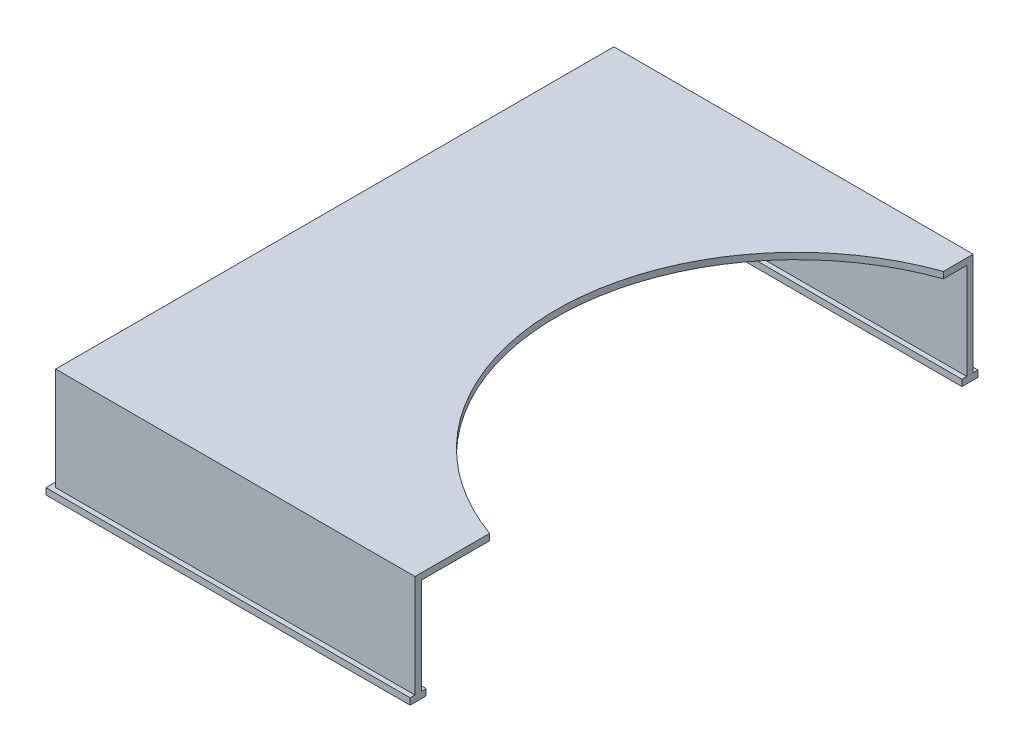
ISO-10303-21;
HEADER;
FILE_DESCRIPTION(('STEP AP214'),'2;1');
FILE_NAME('part.step','',(''),(''),'','','');
FILE_SCHEMA(('AUTOMOTIVE_DESIGN { 1 0 10303 214 1 1 1 1 }'));
ENDSEC;
DATA;
#1=APPLICATION_CONTEXT('core data for automotive mechanical design processes');
#2=APPLICATION_PROTOCOL_DEFINITION('international standard','automotive_design',2000,#1);
#3=PRODUCT_CONTEXT('',#1,'mechanical');
#4=PRODUCT('Part','Part','',(#3));
#5=PRODUCT_RELATED_PRODUCT_CATEGORY('part','',(#4));
#6=PRODUCT_DEFINITION_FORMATION('','',#4);
#7=PRODUCT_DEFINITION_CONTEXT('part definition',#1,'design');
#8=PRODUCT_DEFINITION('design','',#6,#7);
#9=PRODUCT_DEFINITION_SHAPE('','',#8);
#10=(LENGTH_UNIT() NAMED_UNIT(*) SI_UNIT(.MILLI.,.METRE.));
#11=(NAMED_UNIT(*) PLANE_ANGLE_UNIT() SI_UNIT($,.RADIAN.));
#12=(NAMED_UNIT(*) SI_UNIT($,.STERADIAN.) SOLID_ANGLE_UNIT());
#13=UNCERTAINTY_MEASURE_WITH_UNIT(LENGTH_MEASURE(1.E-05),#10,'distance_accuracy_value','');
#14=(GEOMETRIC_REPRESENTATION_CONTEXT(3) GLOBAL_UNCERTAINTY_ASSIGNED_CONTEXT((#13)) GLOBAL_UNIT_ASSIGNED_CONTEXT((#10,
#11,#12)) REPRESENTATION_CONTEXT('',''));
#15=CARTESIAN_POINT('',(0.,0.,0.));
#16=DIRECTION('',(0.,0.,1.));
#17=DIRECTION('',(1.,0.,0.));
#18=AXIS2_PLACEMENT_3D('',#15,#16,#17);
#19=CARTESIAN_POINT('',(0.,32.,0.));
#20=DIRECTION('',(1.,0.,0.));
#21=DIRECTION('',(0.,0.,-1.));
#22=AXIS2_PLACEMENT_3D('',#19,#20,#21);
#23=PLANE('',#22);
#24=DIRECTION('',(0.,-1.,0.));
#25=VECTOR('',#24,1.);
#26=CARTESIAN_POINT('',(0.,32.,0.));
#27=LINE('',#26,#25);
#28=CARTESIAN_POINT('',(0.,30.,0.));
#29=VERTEX_POINT('',#28);
#30=CARTESIAN_POINT('',(0.,0.,0.));
#31=VERTEX_POINT('',#30);
#32=EDGE_CURVE('E216',#29,#31,#27,.T.);
#33=ORIENTED_EDGE('',*,*,#32,.F.);
#34=DIRECTION('',(0.,0.,1.));
#35=VECTOR('',#34,1.);
#36=CARTESIAN_POINT('',(0.,30.,0.));
#37=LINE('',#36,#35);
#38=CARTESIAN_POINT('',(0.,30.,170.));
#39=VERTEX_POINT('',#38);
#40=EDGE_CURVE('E267',#29,#39,#37,.T.);
#41=ORIENTED_EDGE('',*,*,#40,.T.);
#42=DIRECTION('',(0.,-1.,0.));
#43=VECTOR('',#42,1.);
#44=CARTESIAN_POINT('',(0.,32.,170.));
#45=LINE('',#44,#43);
#46=CARTESIAN_POINT('',(0.,0.,170.));
#47=VERTEX_POINT('',#46);
#48=EDGE_CURVE('E219',#39,#47,#45,.T.);
#49=ORIENTED_EDGE('',*,*,#48,.T.);
#50=DIRECTION('',(0.,0.,1.));
#51=VECTOR('',#50,1.);
#52=CARTESIAN_POINT('',(0.,0.,0.));
#53=LINE('',#52,#51);
#54=EDGE_CURVE('E207',#31,#47,#53,.T.);
#55=ORIENTED_EDGE('',*,*,#54,.F.);
#56=EDGE_LOOP('',(#33,#41,#49,#55));
#57=FACE_BOUND('',#56,.T.);
#58=ADVANCED_FACE('F39',(#57),#23,.T.);
#59=CARTESIAN_POINT('',(0.,32.,170.));
#60=DIRECTION('',(0.,0.,-1.));
#61=DIRECTION('',(-1.,0.,0.));
#62=AXIS2_PLACEMENT_3D('',#59,#60,#61);
#63=PLANE('',#62);
#64=DIRECTION('',(0.,1.,0.));
#65=VECTOR('',#64,1.);
#66=CARTESIAN_POINT('',(110.,32.,170.));
#67=LINE('',#66,#65);
#68=CARTESIAN_POINT('',(110.,0.,170.));
#69=VERTEX_POINT('',#68);
#70=CARTESIAN_POINT('',(110.,30.,170.));
#71=VERTEX_POINT('',#70);
#72=EDGE_CURVE('E308',#69,#71,#67,.T.);
#73=ORIENTED_EDGE('',*,*,#72,.F.);
#74=DIRECTION('',(1.,0.,0.));
#75=VECTOR('',#74,1.);
#76=CARTESIAN_POINT('',(0.,0.,170.));
#77=LINE('',#76,#75);
#78=EDGE_CURVE('E211',#47,#69,#77,.T.);
#79=ORIENTED_EDGE('',*,*,#78,.F.);
#80=ORIENTED_EDGE('',*,*,#48,.F.);
#81=DIRECTION('',(1.,0.,0.));
#82=VECTOR('',#81,1.);
#83=CARTESIAN_POINT('',(-2.,30.,170.));
#84=LINE('',#83,#82);
#85=EDGE_CURVE('E259',#39,#71,#84,.T.);
#86=ORIENTED_EDGE('',*,*,#85,.T.);
#87=EDGE_LOOP('',(#73,#79,#80,#86));
#88=FACE_BOUND('',#87,.T.);
#89=ADVANCED_FACE('F344',(#88),#63,.T.);
#90=CARTESIAN_POINT('',(0.,32.,0.));
#91=DIRECTION('',(0.,0.,1.));
#92=DIRECTION('',(1.,0.,0.));
#93=AXIS2_PLACEMENT_3D('',#90,#91,#92);
#94=PLANE('',#93);
#95=DIRECTION('',(0.,-1.,0.));
#96=VECTOR('',#95,1.);
#97=CARTESIAN_POINT('',(110.,32.,0.));
#98=LINE('',#97,#96);
#99=CARTESIAN_POINT('',(110.,30.,0.));
#100=VERTEX_POINT('',#99);
#101=CARTESIAN_POINT('',(110.,0.,0.));
#102=VERTEX_POINT('',#101);
#103=EDGE_CURVE('E311',#100,#102,#98,.T.);
#104=ORIENTED_EDGE('',*,*,#103,.F.);
#105=DIRECTION('',(-1.,0.,0.));
#106=VECTOR('',#105,1.);
#107=CARTESIAN_POINT('',(0.,30.,0.));
#108=LINE('',#107,#106);
#109=EDGE_CURVE('E242',#100,#29,#108,.T.);
#110=ORIENTED_EDGE('',*,*,#109,.T.);
#111=ORIENTED_EDGE('',*,*,#32,.T.);
#112=DIRECTION('',(-1.,0.,0.));
#113=VECTOR('',#112,1.);
#114=CARTESIAN_POINT('',(0.,0.,0.));
#115=LINE('',#114,#113);
#116=EDGE_CURVE('E214',#102,#31,#115,.T.);
#117=ORIENTED_EDGE('',*,*,#116,.F.);
#118=EDGE_LOOP('',(#104,#110,#111,#117));
#119=FACE_BOUND('',#118,.T.);
#120=ADVANCED_FACE('F350',(#119),#94,.T.);
#121=CARTESIAN_POINT('',(0.,32.,0.));
#122=DIRECTION('',(0.,1.,0.));
#123=DIRECTION('',(0.,0.,1.));
#124=AXIS2_PLACEMENT_3D('',#121,#122,#123);
#125=PLANE('',#124);
#126=DIRECTION('',(0.,0.,1.));
#127=VECTOR('',#126,1.);
#128=CARTESIAN_POINT('',(110.,32.,-3.5));
#129=LINE('',#128,#127);
#130=CARTESIAN_POINT('',(110.,32.,-2.));
#131=VERTEX_POINT('',#130);
#132=CARTESIAN_POINT('',(110.,32.,7.28932188134522));
#133=VERTEX_POINT('',#132);
#134=EDGE_CURVE('E54',#131,#133,#129,.T.);
#135=ORIENTED_EDGE('',*,*,#134,.F.);
#136=DIRECTION('',(-1.,0.,0.));
#137=VECTOR('',#136,1.);
#138=CARTESIAN_POINT('',(-2.,32.,-2.));
#139=LINE('',#138,#137);
#140=CARTESIAN_POINT('',(-2.,32.,-2.));
#141=VERTEX_POINT('',#140);
#142=EDGE_CURVE('E228',#131,#141,#139,.T.);
#143=ORIENTED_EDGE('',*,*,#142,.T.);
#144=DIRECTION('',(0.,0.,1.));
#145=VECTOR('',#144,1.);
#146=CARTESIAN_POINT('',(-2.,32.,-2.));
#147=LINE('',#146,#145);
#148=CARTESIAN_POINT('',(-2.,32.,172.));
#149=VERTEX_POINT('',#148);
#150=EDGE_CURVE('E222',#141,#149,#147,.T.);
#151=ORIENTED_EDGE('',*,*,#150,.T.);
#152=DIRECTION('',(1.,0.,0.));
#153=VECTOR('',#152,1.);
#154=CARTESIAN_POINT('',(-2.,32.,172.));
#155=LINE('',#154,#153);
#156=CARTESIAN_POINT('',(110.,32.,172.));
#157=VERTEX_POINT('',#156);
#158=EDGE_CURVE('E224',#149,#157,#155,.T.);
#159=ORIENTED_EDGE('',*,*,#158,.T.);
#160=CARTESIAN_POINT('',(110.,32.,148.710678118655));
#161=VERTEX_POINT('',#160);
#162=EDGE_CURVE('E256',#161,#157,#129,.T.);
#163=ORIENTED_EDGE('',*,*,#162,.F.);
#164=CARTESIAN_POINT('',(135.,32.,78.));
#165=DIRECTION('',(0.,1.,0.));
#166=DIRECTION('',(0.,0.,1.));
#167=AXIS2_PLACEMENT_3D('',#164,#165,#166);
#168=CIRCLE('',#167,75.);
#169=EDGE_CURVE('E248',#133,#161,#168,.T.);
#170=ORIENTED_EDGE('',*,*,#169,.F.);
#171=EDGE_LOOP('',(#135,#143,#151,#159,#163,#170));
#172=FACE_BOUND('',#171,.T.);
#173=ADVANCED_FACE('F254',(#172),#125,.T.);
#174=CARTESIAN_POINT('',(-2.,32.,-2.));
#175=DIRECTION('',(1.,0.,0.));
#176=DIRECTION('',(0.,0.,-1.));
#177=AXIS2_PLACEMENT_3D('',#174,#175,#176);
#178=PLANE('',#177);
#179=DIRECTION('',(0.,-1.,0.));
#180=VECTOR('',#179,1.);
#181=CARTESIAN_POINT('',(-2.,32.,172.));
#182=LINE('',#181,#180);
#183=CARTESIAN_POINT('',(-2.,0.,172.));
#184=VERTEX_POINT('',#183);
#185=EDGE_CURVE('E239',#149,#184,#182,.T.);
#186=ORIENTED_EDGE('',*,*,#185,.F.);
#187=ORIENTED_EDGE('',*,*,#150,.F.);
#188=DIRECTION('',(0.,-1.,0.));
#189=VECTOR('',#188,1.);
#190=CARTESIAN_POINT('',(-2.,32.,-2.));
#191=LINE('',#190,#189);
#192=CARTESIAN_POINT('',(-2.,0.,-2.));
#193=VERTEX_POINT('',#192);
#194=EDGE_CURVE('E230',#141,#193,#191,.T.);
#195=ORIENTED_EDGE('',*,*,#194,.T.);
#196=DIRECTION('',(0.,0.,1.));
#197=VECTOR('',#196,1.);
#198=CARTESIAN_POINT('',(-2.,0.,-2.));
#199=LINE('',#198,#197);
#200=EDGE_CURVE('E221',#193,#184,#199,.T.);
#201=ORIENTED_EDGE('',*,*,#200,.T.);
#202=EDGE_LOOP('',(#186,#187,#195,#201));
#203=FACE_BOUND('',#202,.T.);
#204=ADVANCED_FACE('F41',(#203),#178,.F.);
#205=CARTESIAN_POINT('',(-2.,32.,172.));
#206=DIRECTION('',(0.,0.,-1.));
#207=DIRECTION('',(-1.,0.,0.));
#208=AXIS2_PLACEMENT_3D('',#205,#206,#207);
#209=PLANE('',#208);
#210=DIRECTION('',(1.,0.,0.));
#211=VECTOR('',#210,1.);
#212=CARTESIAN_POINT('',(-2.,0.,172.));
#213=LINE('',#212,#211);
#214=CARTESIAN_POINT('',(110.,0.,172.));
#215=VERTEX_POINT('',#214);
#216=EDGE_CURVE('E233',#184,#215,#213,.T.);
#217=ORIENTED_EDGE('',*,*,#216,.T.);
#218=DIRECTION('',(0.,1.,0.));
#219=VECTOR('',#218,1.);
#220=CARTESIAN_POINT('',(110.,32.,172.));
#221=LINE('',#220,#219);
#222=EDGE_CURVE('E318',#215,#157,#221,.T.);
#223=ORIENTED_EDGE('',*,*,#222,.T.);
#224=ORIENTED_EDGE('',*,*,#158,.F.);
#225=ORIENTED_EDGE('',*,*,#185,.T.);
#226=EDGE_LOOP('',(#217,#223,#224,#225));
#227=FACE_BOUND('',#226,.T.);
#228=ADVANCED_FACE('F336',(#227),#209,.F.);
#229=CARTESIAN_POINT('',(-2.,32.,-2.));
#230=DIRECTION('',(0.,0.,1.));
#231=DIRECTION('',(1.,0.,0.));
#232=AXIS2_PLACEMENT_3D('',#229,#230,#231);
#233=PLANE('',#232);
#234=ORIENTED_EDGE('',*,*,#142,.F.);
#235=DIRECTION('',(0.,-1.,0.));
#236=VECTOR('',#235,1.);
#237=CARTESIAN_POINT('',(110.,32.,-2.));
#238=LINE('',#237,#236);
#239=CARTESIAN_POINT('',(110.,0.,-2.));
#240=VERTEX_POINT('',#239);
#241=EDGE_CURVE('E257',#131,#240,#238,.T.);
#242=ORIENTED_EDGE('',*,*,#241,.T.);
#243=DIRECTION('',(-1.,0.,0.));
#244=VECTOR('',#243,1.);
#245=CARTESIAN_POINT('',(-2.,0.,-2.));
#246=LINE('',#245,#244);
#247=EDGE_CURVE('E225',#240,#193,#246,.T.);
#248=ORIENTED_EDGE('',*,*,#247,.T.);
#249=ORIENTED_EDGE('',*,*,#194,.F.);
#250=EDGE_LOOP('',(#234,#242,#248,#249));
#251=FACE_BOUND('',#250,.T.);
#252=ADVANCED_FACE('F329',(#251),#233,.F.);
#253=CARTESIAN_POINT('',(0.,0.,0.));
#254=DIRECTION('',(0.,1.,0.));
#255=DIRECTION('',(0.,0.,1.));
#256=AXIS2_PLACEMENT_3D('',#253,#254,#255);
#257=PLANE('',#256);
#258=DIRECTION('',(0.,0.,1.));
#259=VECTOR('',#258,1.);
#260=CARTESIAN_POINT('',(110.,0.,0.));
#261=LINE('',#260,#259);
#262=CARTESIAN_POINT('',(110.,0.,-3.5));
#263=VERTEX_POINT('',#262);
#264=EDGE_CURVE('E262',#263,#240,#261,.T.);
#265=ORIENTED_EDGE('',*,*,#264,.F.);
#266=DIRECTION('',(-1.,0.,0.));
#267=VECTOR('',#266,1.);
#268=CARTESIAN_POINT('',(-3.5,0.,-3.5));
#269=LINE('',#268,#267);
#270=CARTESIAN_POINT('',(-3.5,0.,-3.5));
#271=VERTEX_POINT('',#270);
#272=EDGE_CURVE('E193',#263,#271,#269,.T.);
#273=ORIENTED_EDGE('',*,*,#272,.T.);
#274=DIRECTION('',(0.,0.,1.));
#275=VECTOR('',#274,1.);
#276=CARTESIAN_POINT('',(-3.5,0.,-3.5));
#277=LINE('',#276,#275);
#278=CARTESIAN_POINT('',(-3.5,0.,173.5));
#279=VERTEX_POINT('',#278);
#280=EDGE_CURVE('E197',#271,#279,#277,.T.);
#281=ORIENTED_EDGE('',*,*,#280,.T.);
#282=DIRECTION('',(1.,0.,0.));
#283=VECTOR('',#282,1.);
#284=CARTESIAN_POINT('',(-3.5,0.,173.5));
#285=LINE('',#284,#283);
#286=CARTESIAN_POINT('',(110.,0.,173.5));
#287=VERTEX_POINT('',#286);
#288=EDGE_CURVE('E200',#279,#287,#285,.T.);
#289=ORIENTED_EDGE('',*,*,#288,.T.);
#290=EDGE_CURVE('E167',#215,#287,#261,.T.);
#291=ORIENTED_EDGE('',*,*,#290,.F.);
#292=ORIENTED_EDGE('',*,*,#216,.F.);
#293=ORIENTED_EDGE('',*,*,#200,.F.);
#294=ORIENTED_EDGE('',*,*,#247,.F.);
#295=EDGE_LOOP('',(#265,#273,#281,#289,#291,#292,#293,#294));
#296=FACE_BOUND('',#295,.T.);
#297=ADVANCED_FACE('F332',(#296),#257,.T.);
#298=CARTESIAN_POINT('',(-3.5,-2.,-3.5));
#299=DIRECTION('',(-1.,0.,0.));
#300=DIRECTION('',(0.,0.,1.));
#301=AXIS2_PLACEMENT_3D('',#298,#299,#300);
#302=PLANE('',#301);
#303=ORIENTED_EDGE('',*,*,#280,.F.);
#304=DIRECTION('',(0.,1.,0.));
#305=VECTOR('',#304,1.);
#306=CARTESIAN_POINT('',(-3.5,-2.,-3.5));
#307=LINE('',#306,#305);
#308=CARTESIAN_POINT('',(-3.5,-2.,-3.5));
#309=VERTEX_POINT('',#308);
#310=EDGE_CURVE('E204',#309,#271,#307,.T.);
#311=ORIENTED_EDGE('',*,*,#310,.F.);
#312=DIRECTION('',(0.,0.,1.));
#313=VECTOR('',#312,1.);
#314=CARTESIAN_POINT('',(-3.5,-2.,-3.5));
#315=LINE('',#314,#313);
#316=CARTESIAN_POINT('',(-3.5,-2.,173.5));
#317=VERTEX_POINT('',#316);
#318=EDGE_CURVE('E190',#309,#317,#315,.T.);
#319=ORIENTED_EDGE('',*,*,#318,.T.);
#320=DIRECTION('',(0.,1.,0.));
#321=VECTOR('',#320,1.);
#322=CARTESIAN_POINT('',(-3.5,-2.,173.5));
#323=LINE('',#322,#321);
#324=EDGE_CURVE('E188',#317,#279,#323,.T.);
#325=ORIENTED_EDGE('',*,*,#324,.T.);
#326=EDGE_LOOP('',(#303,#311,#319,#325));
#327=FACE_BOUND('',#326,.T.);
#328=ADVANCED_FACE('F365',(#327),#302,.T.);
#329=CARTESIAN_POINT('',(-3.5,-2.,-3.5));
#330=DIRECTION('',(0.,0.,-1.));
#331=DIRECTION('',(-1.,0.,0.));
#332=AXIS2_PLACEMENT_3D('',#329,#330,#331);
#333=PLANE('',#332);
#334=DIRECTION('',(0.,1.,0.));
#335=VECTOR('',#334,1.);
#336=CARTESIAN_POINT('',(110.,-2.,-3.5));
#337=LINE('',#336,#335);
#338=CARTESIAN_POINT('',(110.,-2.,-3.5));
#339=VERTEX_POINT('',#338);
#340=EDGE_CURVE('E172',#339,#263,#337,.T.);
#341=ORIENTED_EDGE('',*,*,#340,.F.);
#342=DIRECTION('',(-1.,0.,0.));
#343=VECTOR('',#342,1.);
#344=CARTESIAN_POINT('',(-3.5,-2.,-3.5));
#345=LINE('',#344,#343);
#346=EDGE_CURVE('E189',#339,#309,#345,.T.);
#347=ORIENTED_EDGE('',*,*,#346,.T.);
#348=ORIENTED_EDGE('',*,*,#310,.T.);
#349=ORIENTED_EDGE('',*,*,#272,.F.);
#350=EDGE_LOOP('',(#341,#347,#348,#349));
#351=FACE_BOUND('',#350,.T.);
#352=ADVANCED_FACE('F368',(#351),#333,.T.);
#353=CARTESIAN_POINT('',(-3.5,-2.,173.5));
#354=DIRECTION('',(0.,0.,1.));
#355=DIRECTION('',(1.,0.,0.));
#356=AXIS2_PLACEMENT_3D('',#353,#354,#355);
#357=PLANE('',#356);
#358=DIRECTION('',(0.,1.,0.));
#359=VECTOR('',#358,1.);
#360=CARTESIAN_POINT('',(110.,-2.,173.5));
#361=LINE('',#360,#359);
#362=CARTESIAN_POINT('',(110.,-2.,173.5));
#363=VERTEX_POINT('',#362);
#364=EDGE_CURVE('E161',#363,#287,#361,.T.);
#365=ORIENTED_EDGE('',*,*,#364,.T.);
#366=ORIENTED_EDGE('',*,*,#288,.F.);
#367=ORIENTED_EDGE('',*,*,#324,.F.);
#368=DIRECTION('',(1.,0.,0.));
#369=VECTOR('',#368,1.);
#370=CARTESIAN_POINT('',(-3.5,-2.,173.5));
#371=LINE('',#370,#369);
#372=EDGE_CURVE('E181',#317,#363,#371,.T.);
#373=ORIENTED_EDGE('',*,*,#372,.T.);
#374=EDGE_LOOP('',(#365,#366,#367,#373));
#375=FACE_BOUND('',#374,.T.);
#376=ADVANCED_FACE('F187',(#375),#357,.T.);
#377=CARTESIAN_POINT('',(0.,-2.,0.));
#378=DIRECTION('',(0.,1.,0.));
#379=DIRECTION('',(0.,0.,1.));
#380=AXIS2_PLACEMENT_3D('',#377,#378,#379);
#381=PLANE('',#380);
#382=ORIENTED_EDGE('',*,*,#346,.F.);
#383=DIRECTION('',(0.,0.,1.));
#384=VECTOR('',#383,1.);
#385=CARTESIAN_POINT('',(110.,-2.,-3.5));
#386=LINE('',#385,#384);
#387=CARTESIAN_POINT('',(110.,-2.,1.5));
#388=VERTEX_POINT('',#387);
#389=EDGE_CURVE('E173',#339,#388,#386,.T.);
#390=ORIENTED_EDGE('',*,*,#389,.T.);
#391=DIRECTION('',(-1.,0.,0.));
#392=VECTOR('',#391,1.);
#393=CARTESIAN_POINT('',(218.5,-2.,1.5));
#394=LINE('',#393,#392);
#395=CARTESIAN_POINT('',(1.5,-2.,1.5));
#396=VERTEX_POINT('',#395);
#397=EDGE_CURVE('E271',#388,#396,#394,.T.);
#398=ORIENTED_EDGE('',*,*,#397,.T.);
#399=DIRECTION('',(0.,0.,1.));
#400=VECTOR('',#399,1.);
#401=CARTESIAN_POINT('',(1.5,-2.,168.5));
#402=LINE('',#401,#400);
#403=CARTESIAN_POINT('',(1.5,-2.,168.5));
#404=VERTEX_POINT('',#403);
#405=EDGE_CURVE('E273',#396,#404,#402,.T.);
#406=ORIENTED_EDGE('',*,*,#405,.T.);
#407=DIRECTION('',(1.,0.,0.));
#408=VECTOR('',#407,1.);
#409=CARTESIAN_POINT('',(218.5,-2.,168.5));
#410=LINE('',#409,#408);
#411=CARTESIAN_POINT('',(110.,-2.,168.5));
#412=VERTEX_POINT('',#411);
#413=EDGE_CURVE('E185',#404,#412,#410,.T.);
#414=ORIENTED_EDGE('',*,*,#413,.T.);
#415=EDGE_CURVE('E164',#412,#363,#386,.T.);
#416=ORIENTED_EDGE('',*,*,#415,.T.);
#417=ORIENTED_EDGE('',*,*,#372,.F.);
#418=ORIENTED_EDGE('',*,*,#318,.F.);
#419=EDGE_LOOP('',(#382,#390,#398,#406,#414,#416,#417,#418));
#420=FACE_BOUND('',#419,.T.);
#421=ADVANCED_FACE('F179',(#420),#381,.F.);
#422=DIRECTION('',(0.,0.,1.));
#423=VECTOR('',#422,1.);
#424=CARTESIAN_POINT('',(110.,0.,0.));
#425=LINE('',#424,#423);
#426=CARTESIAN_POINT('',(110.,0.,1.5));
#427=VERTEX_POINT('',#426);
#428=EDGE_CURVE('E306',#102,#427,#425,.T.);
#429=ORIENTED_EDGE('',*,*,#428,.F.);
#430=ORIENTED_EDGE('',*,*,#116,.T.);
#431=ORIENTED_EDGE('',*,*,#54,.T.);
#432=ORIENTED_EDGE('',*,*,#78,.T.);
#433=CARTESIAN_POINT('',(110.,0.,168.5));
#434=VERTEX_POINT('',#433);
#435=EDGE_CURVE('E298',#434,#69,#425,.T.);
#436=ORIENTED_EDGE('',*,*,#435,.F.);
#437=DIRECTION('',(1.,0.,0.));
#438=VECTOR('',#437,1.);
#439=CARTESIAN_POINT('',(218.5,0.,168.5));
#440=LINE('',#439,#438);
#441=CARTESIAN_POINT('',(1.5,0.,168.5));
#442=VERTEX_POINT('',#441);
#443=EDGE_CURVE('E274',#442,#434,#440,.T.);
#444=ORIENTED_EDGE('',*,*,#443,.F.);
#445=DIRECTION('',(0.,0.,1.));
#446=VECTOR('',#445,1.);
#447=CARTESIAN_POINT('',(1.5,0.,168.5));
#448=LINE('',#447,#446);
#449=CARTESIAN_POINT('',(1.5,0.,1.5));
#450=VERTEX_POINT('',#449);
#451=EDGE_CURVE('E279',#450,#442,#448,.T.);
#452=ORIENTED_EDGE('',*,*,#451,.F.);
#453=DIRECTION('',(-1.,0.,0.));
#454=VECTOR('',#453,1.);
#455=CARTESIAN_POINT('',(218.5,0.,1.5));
#456=LINE('',#455,#454);
#457=EDGE_CURVE('E270',#427,#450,#456,.T.);
#458=ORIENTED_EDGE('',*,*,#457,.F.);
#459=EDGE_LOOP('',(#429,#430,#431,#432,#436,#444,#452,#458));
#460=FACE_BOUND('',#459,.T.);
#461=ADVANCED_FACE('F296',(#460),#257,.T.);
#462=CARTESIAN_POINT('',(218.5,-2.,168.5));
#463=DIRECTION('',(0.,0.,1.));
#464=DIRECTION('',(1.,0.,0.));
#465=AXIS2_PLACEMENT_3D('',#462,#463,#464);
#466=PLANE('',#465);
#467=ORIENTED_EDGE('',*,*,#443,.T.);
#468=DIRECTION('',(0.,-1.,0.));
#469=VECTOR('',#468,1.);
#470=CARTESIAN_POINT('',(110.,-2.,168.5));
#471=LINE('',#470,#469);
#472=EDGE_CURVE('E301',#434,#412,#471,.T.);
#473=ORIENTED_EDGE('',*,*,#472,.T.);
#474=ORIENTED_EDGE('',*,*,#413,.F.);
#475=DIRECTION('',(0.,1.,0.));
#476=VECTOR('',#475,1.);
#477=CARTESIAN_POINT('',(1.5,-2.,168.5));
#478=LINE('',#477,#476);
#479=EDGE_CURVE('E201',#404,#442,#478,.T.);
#480=ORIENTED_EDGE('',*,*,#479,.T.);
#481=EDGE_LOOP('',(#467,#473,#474,#480));
#482=FACE_BOUND('',#481,.T.);
#483=ADVANCED_FACE('F300',(#482),#466,.F.);
#484=CARTESIAN_POINT('',(1.5,-2.,168.5));
#485=DIRECTION('',(-1.,0.,0.));
#486=DIRECTION('',(0.,0.,1.));
#487=AXIS2_PLACEMENT_3D('',#484,#485,#486);
#488=PLANE('',#487);
#489=ORIENTED_EDGE('',*,*,#451,.T.);
#490=ORIENTED_EDGE('',*,*,#479,.F.);
#491=ORIENTED_EDGE('',*,*,#405,.F.);
#492=DIRECTION('',(0.,1.,0.));
#493=VECTOR('',#492,1.);
#494=CARTESIAN_POINT('',(1.5,-2.,1.5));
#495=LINE('',#494,#493);
#496=EDGE_CURVE('E277',#396,#450,#495,.T.);
#497=ORIENTED_EDGE('',*,*,#496,.T.);
#498=EDGE_LOOP('',(#489,#490,#491,#497));
#499=FACE_BOUND('',#498,.T.);
#500=ADVANCED_FACE('F289',(#499),#488,.F.);
#501=CARTESIAN_POINT('',(218.5,-2.,1.5));
#502=DIRECTION('',(0.,0.,-1.));
#503=DIRECTION('',(-1.,0.,0.));
#504=AXIS2_PLACEMENT_3D('',#501,#502,#503);
#505=PLANE('',#504);
#506=ORIENTED_EDGE('',*,*,#397,.F.);
#507=DIRECTION('',(0.,1.,0.));
#508=VECTOR('',#507,1.);
#509=CARTESIAN_POINT('',(110.,-2.,1.5));
#510=LINE('',#509,#508);
#511=EDGE_CURVE('E305',#388,#427,#510,.T.);
#512=ORIENTED_EDGE('',*,*,#511,.T.);
#513=ORIENTED_EDGE('',*,*,#457,.T.);
#514=ORIENTED_EDGE('',*,*,#496,.F.);
#515=EDGE_LOOP('',(#506,#512,#513,#514));
#516=FACE_BOUND('',#515,.T.);
#517=ADVANCED_FACE('F304',(#516),#505,.F.);
#518=CARTESIAN_POINT('',(0.,30.,0.));
#519=DIRECTION('',(0.,1.,0.));
#520=DIRECTION('',(0.,0.,1.));
#521=AXIS2_PLACEMENT_3D('',#518,#519,#520);
#522=PLANE('',#521);
#523=ORIENTED_EDGE('',*,*,#109,.F.);
#524=DIRECTION('',(0.,0.,1.));
#525=VECTOR('',#524,1.);
#526=CARTESIAN_POINT('',(110.,30.,0.));
#527=LINE('',#526,#525);
#528=CARTESIAN_POINT('',(110.,30.,7.28932188134522));
#529=VERTEX_POINT('',#528);
#530=EDGE_CURVE('E310',#100,#529,#527,.T.);
#531=ORIENTED_EDGE('',*,*,#530,.T.);
#532=CARTESIAN_POINT('',(135.,30.,78.));
#533=DIRECTION('',(0.,1.,0.));
#534=DIRECTION('',(0.,0.,1.));
#535=AXIS2_PLACEMENT_3D('',#532,#533,#534);
#536=CIRCLE('',#535,75.);
#537=CARTESIAN_POINT('',(110.,30.,148.710678118655));
#538=VERTEX_POINT('',#537);
#539=EDGE_CURVE('E250',#529,#538,#536,.T.);
#540=ORIENTED_EDGE('',*,*,#539,.T.);
#541=EDGE_CURVE('E62',#538,#71,#527,.T.);
#542=ORIENTED_EDGE('',*,*,#541,.T.);
#543=ORIENTED_EDGE('',*,*,#85,.F.);
#544=ORIENTED_EDGE('',*,*,#40,.F.);
#545=EDGE_LOOP('',(#523,#531,#540,#542,#543,#544));
#546=FACE_BOUND('',#545,.T.);
#547=ADVANCED_FACE('F381',(#546),#522,.F.);
#548=CARTESIAN_POINT('',(135.,30.,78.));
#549=DIRECTION('',(0.,1.,0.));
#550=DIRECTION('',(0.,0.,1.));
#551=AXIS2_PLACEMENT_3D('',#548,#549,#550);
#552=CYLINDRICAL_SURFACE('',#551,75.);
#553=ORIENTED_EDGE('',*,*,#169,.T.);
#554=DIRECTION('',(0.,1.,0.));
#555=VECTOR('',#554,1.);
#556=CARTESIAN_POINT('',(110.,30.,148.710678118655));
#557=LINE('',#556,#555);
#558=EDGE_CURVE('E11',#161,#538,#557,.F.);
#559=ORIENTED_EDGE('',*,*,#558,.T.);
#560=ORIENTED_EDGE('',*,*,#539,.F.);
#561=DIRECTION('',(0.,1.,0.));
#562=VECTOR('',#561,1.);
#563=CARTESIAN_POINT('',(110.,30.,7.28932188134522));
#564=LINE('',#563,#562);
#565=EDGE_CURVE('E47',#529,#133,#564,.T.);
#566=ORIENTED_EDGE('',*,*,#565,.T.);
#567=EDGE_LOOP('',(#553,#559,#560,#566));
#568=FACE_BOUND('',#567,.T.);
#569=ADVANCED_FACE('F247',(#568),#552,.F.);
#570=CARTESIAN_POINT('',(110.,-2.,-3.5));
#571=DIRECTION('',(-1.,0.,0.));
#572=DIRECTION('',(0.,0.,1.));
#573=AXIS2_PLACEMENT_3D('',#570,#571,#572);
#574=PLANE('',#573);
#575=ORIENTED_EDGE('',*,*,#134,.T.);
#576=ORIENTED_EDGE('',*,*,#565,.F.);
#577=ORIENTED_EDGE('',*,*,#530,.F.);
#578=ORIENTED_EDGE('',*,*,#103,.T.);
#579=ORIENTED_EDGE('',*,*,#428,.T.);
#580=ORIENTED_EDGE('',*,*,#511,.F.);
#581=ORIENTED_EDGE('',*,*,#389,.F.);
#582=ORIENTED_EDGE('',*,*,#340,.T.);
#583=ORIENTED_EDGE('',*,*,#264,.T.);
#584=ORIENTED_EDGE('',*,*,#241,.F.);
#585=EDGE_LOOP('',(#575,#576,#577,#578,#579,#580,#581,#582,#583,#584));
#586=FACE_BOUND('',#585,.T.);
#587=ADVANCED_FACE('F323',(#586),#574,.F.);
#588=ORIENTED_EDGE('',*,*,#290,.T.);
#589=ORIENTED_EDGE('',*,*,#364,.F.);
#590=ORIENTED_EDGE('',*,*,#415,.F.);
#591=ORIENTED_EDGE('',*,*,#472,.F.);
#592=ORIENTED_EDGE('',*,*,#435,.T.);
#593=ORIENTED_EDGE('',*,*,#72,.T.);
#594=ORIENTED_EDGE('',*,*,#541,.F.);
#595=ORIENTED_EDGE('',*,*,#558,.F.);
#596=ORIENTED_EDGE('',*,*,#162,.T.);
#597=ORIENTED_EDGE('',*,*,#222,.F.);
#598=EDGE_LOOP('',(#588,#589,#590,#591,#592,#593,#594,#595,#596,#597));
#599=FACE_BOUND('',#598,.T.);
#600=ADVANCED_FACE('F163',(#599),#574,.F.);
#601=CLOSED_SHELL('',(#58,#89,#120,#173,#204,#228,#252,#297,#328,#352,#376,#421,#461,#483,#500,
#517,#547,#569,#587,#600));
#602=MANIFOLD_SOLID_BREP('B2',#601);
#603=ADVANCED_BREP_SHAPE_REPRESENTATION('',(#18,#602),#14);
#604=SHAPE_DEFINITION_REPRESENTATION(#9,#603);
ENDSEC;
END-ISO-10303-21;
